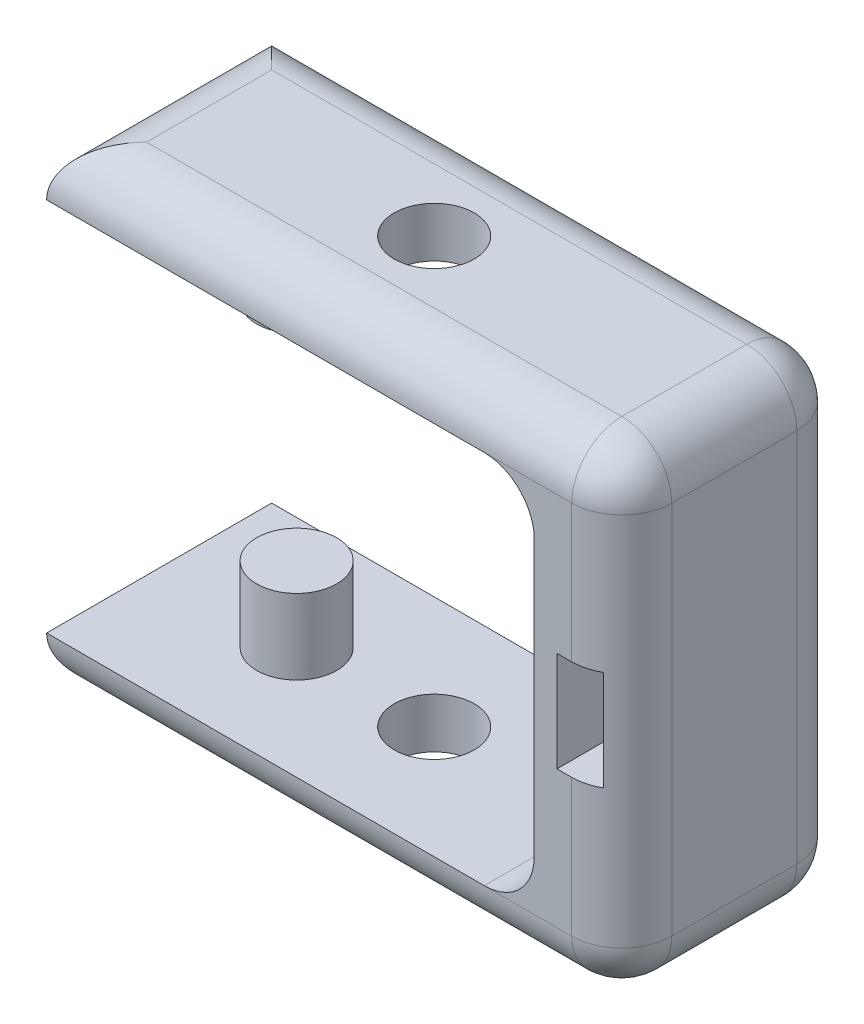
ISO-10303-21;
HEADER;
FILE_DESCRIPTION(('STEP AP214'),'2;1');
FILE_NAME('part.step','',(''),(''),'','','');
FILE_SCHEMA(('AUTOMOTIVE_DESIGN { 1 0 10303 214 1 1 1 1 }'));
ENDSEC;
DATA;
#1=APPLICATION_CONTEXT('core data for automotive mechanical design processes');
#2=APPLICATION_PROTOCOL_DEFINITION('international standard','automotive_design',2000,#1);
#3=PRODUCT_CONTEXT('',#1,'mechanical');
#4=PRODUCT('Part','Part','',(#3));
#5=PRODUCT_RELATED_PRODUCT_CATEGORY('part','',(#4));
#6=PRODUCT_DEFINITION_FORMATION('','',#4);
#7=PRODUCT_DEFINITION_CONTEXT('part definition',#1,'design');
#8=PRODUCT_DEFINITION('design','',#6,#7);
#9=PRODUCT_DEFINITION_SHAPE('','',#8);
#10=(LENGTH_UNIT() NAMED_UNIT(*) SI_UNIT(.MILLI.,.METRE.));
#11=(NAMED_UNIT(*) PLANE_ANGLE_UNIT() SI_UNIT($,.RADIAN.));
#12=(NAMED_UNIT(*) SI_UNIT($,.STERADIAN.) SOLID_ANGLE_UNIT());
#13=UNCERTAINTY_MEASURE_WITH_UNIT(LENGTH_MEASURE(1.E-05),#10,'distance_accuracy_value','');
#14=(GEOMETRIC_REPRESENTATION_CONTEXT(3) GLOBAL_UNCERTAINTY_ASSIGNED_CONTEXT((#13)) GLOBAL_UNIT_ASSIGNED_CONTEXT((#10,
#11,#12)) REPRESENTATION_CONTEXT('',''));
#15=CARTESIAN_POINT('',(0.,0.,0.));
#16=DIRECTION('',(0.,0.,1.));
#17=DIRECTION('',(1.,0.,0.));
#18=AXIS2_PLACEMENT_3D('',#15,#16,#17);
#19=CARTESIAN_POINT('',(0.,0.,-2.25144508670519));
#20=DIRECTION('',(0.,0.,-1.));
#21=DIRECTION('',(-1.,0.,0.));
#22=AXIS2_PLACEMENT_3D('',#19,#20,#21);
#23=PLANE('',#22);
#24=DIRECTION('',(0.,1.,0.));
#25=VECTOR('',#24,1.);
#26=CARTESIAN_POINT('',(10.3670520231214,11.5,-2.25144508670519));
#27=LINE('',#26,#25);
#28=CARTESIAN_POINT('',(10.3670520231214,7.5,-2.25144508670519));
#29=VERTEX_POINT('',#28);
#30=CARTESIAN_POINT('',(10.3670520231214,11.5,-2.25144508670519));
#31=VERTEX_POINT('',#30);
#32=EDGE_CURVE('E234',#29,#31,#27,.T.);
#33=ORIENTED_EDGE('',*,*,#32,.T.);
#34=DIRECTION('',(-1.,0.,0.));
#35=VECTOR('',#34,1.);
#36=CARTESIAN_POINT('',(10.3670520231214,11.5,-2.25144508670519));
#37=LINE('',#36,#35);
#38=CARTESIAN_POINT('',(8.77705202312139,11.5,-2.25144508670519));
#39=VERTEX_POINT('',#38);
#40=EDGE_CURVE('E237',#31,#39,#37,.T.);
#41=ORIENTED_EDGE('',*,*,#40,.T.);
#42=DIRECTION('',(0.,-1.,0.));
#43=VECTOR('',#42,1.);
#44=CARTESIAN_POINT('',(8.77705202312139,11.5,-2.25144508670519));
#45=LINE('',#44,#43);
#46=CARTESIAN_POINT('',(8.77705202312139,7.5,-2.25144508670519));
#47=VERTEX_POINT('',#46);
#48=EDGE_CURVE('E241',#39,#47,#45,.T.);
#49=ORIENTED_EDGE('',*,*,#48,.T.);
#50=DIRECTION('',(1.,0.,0.));
#51=VECTOR('',#50,1.);
#52=CARTESIAN_POINT('',(10.3670520231214,7.5,-2.25144508670519));
#53=LINE('',#52,#51);
#54=EDGE_CURVE('E244',#47,#29,#53,.T.);
#55=ORIENTED_EDGE('',*,*,#54,.T.);
#56=EDGE_LOOP('',(#33,#41,#49,#55));
#57=FACE_BOUND('',#56,.T.);
#58=DIRECTION('',(0.,-1.,0.));
#59=VECTOR('',#58,1.);
#60=CARTESIAN_POINT('',(8.97705202312138,11.3,-2.25144508670519));
#61=LINE('',#60,#59);
#62=CARTESIAN_POINT('',(8.97705202312138,11.3,-2.25144508670519));
#63=VERTEX_POINT('',#62);
#64=CARTESIAN_POINT('',(8.97705202312139,7.7,-2.25144508670519));
#65=VERTEX_POINT('',#64);
#66=EDGE_CURVE('E204',#63,#65,#61,.T.);
#67=ORIENTED_EDGE('',*,*,#66,.F.);
#68=DIRECTION('',(-1.,0.,0.));
#69=VECTOR('',#68,1.);
#70=CARTESIAN_POINT('',(8.97705202312138,11.3,-2.25144508670519));
#71=LINE('',#70,#69);
#72=CARTESIAN_POINT('',(10.1670520231214,11.3,-2.25144508670519));
#73=VERTEX_POINT('',#72);
#74=EDGE_CURVE('E218',#73,#63,#71,.T.);
#75=ORIENTED_EDGE('',*,*,#74,.F.);
#76=DIRECTION('',(0.,1.,0.));
#77=VECTOR('',#76,1.);
#78=CARTESIAN_POINT('',(10.1670520231214,11.3,-2.25144508670519));
#79=LINE('',#78,#77);
#80=CARTESIAN_POINT('',(10.1670520231214,7.7,-2.25144508670519));
#81=VERTEX_POINT('',#80);
#82=EDGE_CURVE('E51',#81,#73,#79,.T.);
#83=ORIENTED_EDGE('',*,*,#82,.F.);
#84=DIRECTION('',(1.,0.,0.));
#85=VECTOR('',#84,1.);
#86=CARTESIAN_POINT('',(8.97705202312139,7.7,-2.25144508670519));
#87=LINE('',#86,#85);
#88=EDGE_CURVE('E225',#65,#81,#87,.T.);
#89=ORIENTED_EDGE('',*,*,#88,.F.);
#90=EDGE_LOOP('',(#67,#75,#83,#89));
#91=FACE_BOUND('',#90,.T.);
#92=ADVANCED_FACE('F36',(#57,#91),#23,.F.);
#93=CARTESIAN_POINT('',(-0.632947976878616,0.,-0.751445086705187));
#94=DIRECTION('',(0.,1.,0.));
#95=DIRECTION('',(0.,0.,1.));
#96=AXIS2_PLACEMENT_3D('',#93,#94,#95);
#97=CYLINDRICAL_SURFACE('',#96,1.6);
#98=CARTESIAN_POINT('',(-0.632947976878616,17.,-0.751445086705187));
#99=DIRECTION('',(0.,1.,0.));
#100=DIRECTION('',(0.,0.,1.));
#101=AXIS2_PLACEMENT_3D('',#98,#99,#100);
#102=CIRCLE('',#101,1.6);
#103=CARTESIAN_POINT('',(-0.632947976878616,17.,0.848554913294813));
#104=VERTEX_POINT('',#103);
#105=EDGE_CURVE('E301',#104,#104,#102,.F.);
#106=ORIENTED_EDGE('',*,*,#105,.T.);
#107=EDGE_LOOP('',(#106));
#108=FACE_BOUND('',#107,.T.);
#109=CARTESIAN_POINT('',(-0.632947976878616,19.,-0.751445086705187));
#110=DIRECTION('',(0.,1.,0.));
#111=DIRECTION('',(0.,0.,1.));
#112=AXIS2_PLACEMENT_3D('',#109,#110,#111);
#113=CIRCLE('',#112,1.6);
#114=CARTESIAN_POINT('',(-0.632947976878616,19.,0.848554913294813));
#115=VERTEX_POINT('',#114);
#116=EDGE_CURVE('E298',#115,#115,#113,.T.);
#117=ORIENTED_EDGE('',*,*,#116,.T.);
#118=EDGE_LOOP('',(#117));
#119=FACE_BOUND('',#118,.T.);
#120=ADVANCED_FACE('F522',(#108,#119),#97,.F.);
#121=CARTESIAN_POINT('',(-11.6329479768786,19.,3.74855491329481));
#122=DIRECTION('',(0.,0.,-1.));
#123=DIRECTION('',(-1.,0.,0.));
#124=AXIS2_PLACEMENT_3D('',#121,#122,#123);
#125=PLANE('',#124);
#126=DIRECTION('',(0.,-1.,0.));
#127=VECTOR('',#126,1.);
#128=CARTESIAN_POINT('',(9.36705202312138,19.,3.74855491329481));
#129=LINE('',#128,#127);
#130=CARTESIAN_POINT('',(9.36705202312138,2.,3.74855491329481));
#131=VERTEX_POINT('',#130);
#132=CARTESIAN_POINT('',(9.36705202312138,7.5,3.74855491329481));
#133=VERTEX_POINT('',#132);
#134=EDGE_CURVE('E332',#131,#133,#129,.F.);
#135=ORIENTED_EDGE('',*,*,#134,.T.);
#136=DIRECTION('',(1.,0.,0.));
#137=VECTOR('',#136,1.);
#138=CARTESIAN_POINT('',(10.3670520231214,7.5,3.74855491329481));
#139=LINE('',#138,#137);
#140=CARTESIAN_POINT('',(8.77705202312139,7.5,3.74855491329481));
#141=VERTEX_POINT('',#140);
#142=EDGE_CURVE('E238',#141,#133,#139,.T.);
#143=ORIENTED_EDGE('',*,*,#142,.F.);
#144=DIRECTION('',(0.,-1.,0.));
#145=VECTOR('',#144,1.);
#146=CARTESIAN_POINT('',(8.77705202312139,11.5,3.74855491329481));
#147=LINE('',#146,#145);
#148=CARTESIAN_POINT('',(8.77705202312139,11.5,3.74855491329481));
#149=VERTEX_POINT('',#148);
#150=EDGE_CURVE('E249',#149,#141,#147,.T.);
#151=ORIENTED_EDGE('',*,*,#150,.F.);
#152=DIRECTION('',(-1.,0.,0.));
#153=VECTOR('',#152,1.);
#154=CARTESIAN_POINT('',(10.3670520231214,11.5,3.74855491329481));
#155=LINE('',#154,#153);
#156=CARTESIAN_POINT('',(9.36705202312138,11.5,3.74855491329481));
#157=VERTEX_POINT('',#156);
#158=EDGE_CURVE('E230',#157,#149,#155,.T.);
#159=ORIENTED_EDGE('',*,*,#158,.F.);
#160=CARTESIAN_POINT('',(9.36705202312138,17.,3.74855491329481));
#161=VERTEX_POINT('',#160);
#162=EDGE_CURVE('E331',#157,#161,#129,.F.);
#163=ORIENTED_EDGE('',*,*,#162,.T.);
#164=DIRECTION('',(1.,0.,0.));
#165=VECTOR('',#164,1.);
#166=CARTESIAN_POINT('',(-11.6329479768786,17.,3.74855491329481));
#167=LINE('',#166,#165);
#168=CARTESIAN_POINT('',(5.86705202312139,17.,3.74855491329481));
#169=VERTEX_POINT('',#168);
#170=EDGE_CURVE('E364',#161,#169,#167,.F.);
#171=ORIENTED_EDGE('',*,*,#170,.T.);
#172=CARTESIAN_POINT('',(5.86705202312139,15.,3.74855491329481));
#173=DIRECTION('',(0.,0.,-1.));
#174=DIRECTION('',(-1.,0.,0.));
#175=AXIS2_PLACEMENT_3D('',#172,#173,#174);
#176=CIRCLE('',#175,2.);
#177=CARTESIAN_POINT('',(7.86705202312139,15.,3.74855491329481));
#178=VERTEX_POINT('',#177);
#179=EDGE_CURVE('E356',#169,#178,#176,.T.);
#180=ORIENTED_EDGE('',*,*,#179,.T.);
#181=DIRECTION('',(0.,1.,0.));
#182=VECTOR('',#181,1.);
#183=CARTESIAN_POINT('',(7.86705202312139,17.,3.74855491329481));
#184=LINE('',#183,#182);
#185=CARTESIAN_POINT('',(7.86705202312139,4.,3.74855491329481));
#186=VERTEX_POINT('',#185);
#187=EDGE_CURVE('E284',#186,#178,#184,.T.);
#188=ORIENTED_EDGE('',*,*,#187,.F.);
#189=CARTESIAN_POINT('',(5.86705202312139,4.,3.74855491329481));
#190=DIRECTION('',(0.,0.,-1.));
#191=DIRECTION('',(-1.,0.,0.));
#192=AXIS2_PLACEMENT_3D('',#189,#190,#191);
#193=CIRCLE('',#192,2.);
#194=CARTESIAN_POINT('',(5.86705202312139,2.,3.74855491329481));
#195=VERTEX_POINT('',#194);
#196=EDGE_CURVE('E360',#186,#195,#193,.T.);
#197=ORIENTED_EDGE('',*,*,#196,.T.);
#198=DIRECTION('',(1.,0.,0.));
#199=VECTOR('',#198,1.);
#200=CARTESIAN_POINT('',(-11.6329479768786,2.,3.74855491329481));
#201=LINE('',#200,#199);
#202=EDGE_CURVE('E367',#195,#131,#201,.T.);
#203=ORIENTED_EDGE('',*,*,#202,.T.);
#204=EDGE_LOOP('',(#135,#143,#151,#159,#163,#171,#180,#188,#197,#203));
#205=FACE_BOUND('',#204,.T.);
#206=ADVANCED_FACE('F457',(#205),#125,.F.);
#207=CARTESIAN_POINT('',(11.3670520231214,19.,-5.25144508670519));
#208=DIRECTION('',(-1.,0.,0.));
#209=DIRECTION('',(0.,0.,1.));
#210=AXIS2_PLACEMENT_3D('',#207,#208,#209);
#211=PLANE('',#210);
#212=DIRECTION('',(0.,-1.,0.));
#213=VECTOR('',#212,1.);
#214=CARTESIAN_POINT('',(11.3670520231214,19.,1.74855491329481));
#215=LINE('',#214,#213);
#216=CARTESIAN_POINT('',(11.3670520231214,17.,1.74855491329481));
#217=VERTEX_POINT('',#216);
#218=CARTESIAN_POINT('',(11.3670520231214,2.,1.74855491329481));
#219=VERTEX_POINT('',#218);
#220=EDGE_CURVE('E342',#217,#219,#215,.T.);
#221=ORIENTED_EDGE('',*,*,#220,.T.);
#222=DIRECTION('',(0.,0.,-1.));
#223=VECTOR('',#222,1.);
#224=CARTESIAN_POINT('',(11.3670520231214,2.,-5.25144508670519));
#225=LINE('',#224,#223);
#226=CARTESIAN_POINT('',(11.3670520231214,2.,-3.25144508670519));
#227=VERTEX_POINT('',#226);
#228=EDGE_CURVE('E344',#219,#227,#225,.T.);
#229=ORIENTED_EDGE('',*,*,#228,.T.);
#230=DIRECTION('',(0.,-1.,0.));
#231=VECTOR('',#230,1.);
#232=CARTESIAN_POINT('',(11.3670520231214,19.,-3.25144508670519));
#233=LINE('',#232,#231);
#234=CARTESIAN_POINT('',(11.3670520231214,17.,-3.25144508670519));
#235=VERTEX_POINT('',#234);
#236=EDGE_CURVE('E340',#227,#235,#233,.F.);
#237=ORIENTED_EDGE('',*,*,#236,.T.);
#238=DIRECTION('',(0.,0.,-1.));
#239=VECTOR('',#238,1.);
#240=CARTESIAN_POINT('',(11.3670520231214,17.,3.74855491329481));
#241=LINE('',#240,#239);
#242=EDGE_CURVE('E338',#235,#217,#241,.F.);
#243=ORIENTED_EDGE('',*,*,#242,.T.);
#244=EDGE_LOOP('',(#221,#229,#237,#243));
#245=FACE_BOUND('',#244,.T.);
#246=ADVANCED_FACE('F475',(#245),#211,.F.);
#247=CARTESIAN_POINT('',(-11.6329479768786,19.,-5.25144508670519));
#248=DIRECTION('',(0.,0.,1.));
#249=DIRECTION('',(1.,0.,0.));
#250=AXIS2_PLACEMENT_3D('',#247,#248,#249);
#251=PLANE('',#250);
#252=DIRECTION('',(0.,-1.,0.));
#253=VECTOR('',#252,1.);
#254=CARTESIAN_POINT('',(9.36705202312138,19.,-5.25144508670519));
#255=LINE('',#254,#253);
#256=CARTESIAN_POINT('',(9.36705202312138,17.,-5.25144508670519));
#257=VERTEX_POINT('',#256);
#258=CARTESIAN_POINT('',(9.36705202312138,11.3,-5.25144508670519));
#259=VERTEX_POINT('',#258);
#260=EDGE_CURVE('E336',#257,#259,#255,.T.);
#261=ORIENTED_EDGE('',*,*,#260,.T.);
#262=DIRECTION('',(-1.,0.,0.));
#263=VECTOR('',#262,1.);
#264=CARTESIAN_POINT('',(8.97705202312138,11.3,-5.25144508670519));
#265=LINE('',#264,#263);
#266=CARTESIAN_POINT('',(8.97705202312138,11.3,-5.25144508670519));
#267=VERTEX_POINT('',#266);
#268=EDGE_CURVE('E206',#259,#267,#265,.T.);
#269=ORIENTED_EDGE('',*,*,#268,.T.);
#270=DIRECTION('',(0.,-1.,0.));
#271=VECTOR('',#270,1.);
#272=CARTESIAN_POINT('',(8.97705202312138,11.3,-5.25144508670519));
#273=LINE('',#272,#271);
#274=CARTESIAN_POINT('',(8.97705202312139,7.7,-5.25144508670519));
#275=VERTEX_POINT('',#274);
#276=EDGE_CURVE('E201',#267,#275,#273,.T.);
#277=ORIENTED_EDGE('',*,*,#276,.T.);
#278=DIRECTION('',(1.,0.,0.));
#279=VECTOR('',#278,1.);
#280=CARTESIAN_POINT('',(8.97705202312139,7.7,-5.25144508670519));
#281=LINE('',#280,#279);
#282=CARTESIAN_POINT('',(9.36705202312138,7.7,-5.25144508670519));
#283=VERTEX_POINT('',#282);
#284=EDGE_CURVE('E209',#275,#283,#281,.T.);
#285=ORIENTED_EDGE('',*,*,#284,.T.);
#286=CARTESIAN_POINT('',(9.36705202312138,2.,-5.25144508670519));
#287=VERTEX_POINT('',#286);
#288=EDGE_CURVE('E335',#283,#287,#255,.T.);
#289=ORIENTED_EDGE('',*,*,#288,.T.);
#290=DIRECTION('',(-1.,0.,0.));
#291=VECTOR('',#290,1.);
#292=CARTESIAN_POINT('',(-11.6329479768786,2.,-5.25144508670519));
#293=LINE('',#292,#291);
#294=CARTESIAN_POINT('',(5.86705202312139,2.,-5.25144508670519));
#295=VERTEX_POINT('',#294);
#296=EDGE_CURVE('E371',#287,#295,#293,.T.);
#297=ORIENTED_EDGE('',*,*,#296,.T.);
#298=CARTESIAN_POINT('',(5.86705202312139,4.,-5.25144508670519));
#299=DIRECTION('',(0.,0.,1.));
#300=DIRECTION('',(1.,0.,0.));
#301=AXIS2_PLACEMENT_3D('',#298,#299,#300);
#302=CIRCLE('',#301,2.);
#303=CARTESIAN_POINT('',(7.86705202312139,4.,-5.25144508670519));
#304=VERTEX_POINT('',#303);
#305=EDGE_CURVE('E362',#295,#304,#302,.T.);
#306=ORIENTED_EDGE('',*,*,#305,.T.);
#307=DIRECTION('',(0.,1.,0.));
#308=VECTOR('',#307,1.);
#309=CARTESIAN_POINT('',(7.86705202312139,17.,-5.25144508670519));
#310=LINE('',#309,#308);
#311=CARTESIAN_POINT('',(7.86705202312139,15.,-5.25144508670519));
#312=VERTEX_POINT('',#311);
#313=EDGE_CURVE('E274',#304,#312,#310,.T.);
#314=ORIENTED_EDGE('',*,*,#313,.T.);
#315=CARTESIAN_POINT('',(5.86705202312139,15.,-5.25144508670519));
#316=DIRECTION('',(0.,0.,1.));
#317=DIRECTION('',(1.,0.,0.));
#318=AXIS2_PLACEMENT_3D('',#315,#316,#317);
#319=CIRCLE('',#318,2.);
#320=CARTESIAN_POINT('',(5.86705202312139,17.,-5.25144508670519));
#321=VERTEX_POINT('',#320);
#322=EDGE_CURVE('E358',#312,#321,#319,.T.);
#323=ORIENTED_EDGE('',*,*,#322,.T.);
#324=DIRECTION('',(-1.,0.,0.));
#325=VECTOR('',#324,1.);
#326=CARTESIAN_POINT('',(11.3670520231214,17.,-5.25144508670519));
#327=LINE('',#326,#325);
#328=EDGE_CURVE('E369',#321,#257,#327,.F.);
#329=ORIENTED_EDGE('',*,*,#328,.T.);
#330=EDGE_LOOP('',(#261,#269,#277,#285,#289,#297,#306,#314,#323,#329));
#331=FACE_BOUND('',#330,.T.);
#332=ADVANCED_FACE('F217',(#331),#251,.F.);
#333=CARTESIAN_POINT('',(0.,19.,0.));
#334=DIRECTION('',(0.,1.,0.));
#335=DIRECTION('',(0.,0.,1.));
#336=AXIS2_PLACEMENT_3D('',#333,#334,#335);
#337=PLANE('',#336);
#338=DIRECTION('',(0.,0.,-1.));
#339=VECTOR('',#338,1.);
#340=CARTESIAN_POINT('',(9.36705202312138,19.,-5.25144508670519));
#341=LINE('',#340,#339);
#342=CARTESIAN_POINT('',(9.36705202312138,19.,1.74855491329481));
#343=VERTEX_POINT('',#342);
#344=CARTESIAN_POINT('',(9.36705202312138,19.,-3.25144508670519));
#345=VERTEX_POINT('',#344);
#346=EDGE_CURVE('E351',#343,#345,#341,.T.);
#347=ORIENTED_EDGE('',*,*,#346,.T.);
#348=DIRECTION('',(-1.,0.,0.));
#349=VECTOR('',#348,1.);
#350=CARTESIAN_POINT('',(-11.6329479768786,19.,-3.25144508670519));
#351=LINE('',#350,#349);
#352=CARTESIAN_POINT('',(-9.63294797687862,19.,-3.25144508670519));
#353=VERTEX_POINT('',#352);
#354=EDGE_CURVE('E353',#345,#353,#351,.T.);
#355=ORIENTED_EDGE('',*,*,#354,.T.);
#356=DIRECTION('',(0.,0.,1.));
#357=VECTOR('',#356,1.);
#358=CARTESIAN_POINT('',(-9.63294797687861,19.,3.74855491329481));
#359=LINE('',#358,#357);
#360=CARTESIAN_POINT('',(-9.63294797687861,19.,1.74855491329481));
#361=VERTEX_POINT('',#360);
#362=EDGE_CURVE('E347',#353,#361,#359,.T.);
#363=ORIENTED_EDGE('',*,*,#362,.T.);
#364=DIRECTION('',(1.,0.,0.));
#365=VECTOR('',#364,1.);
#366=CARTESIAN_POINT('',(11.3670520231214,19.,1.74855491329481));
#367=LINE('',#366,#365);
#368=EDGE_CURVE('E349',#361,#343,#367,.T.);
#369=ORIENTED_EDGE('',*,*,#368,.T.);
#370=EDGE_LOOP('',(#347,#355,#363,#369));
#371=FACE_BOUND('',#370,.T.);
#372=ORIENTED_EDGE('',*,*,#116,.F.);
#373=EDGE_LOOP('',(#372));
#374=FACE_BOUND('',#373,.T.);
#375=ADVANCED_FACE('F573',(#371,#374),#337,.T.);
#376=CARTESIAN_POINT('',(0.,0.,0.));
#377=DIRECTION('',(0.,1.,0.));
#378=DIRECTION('',(0.,0.,1.));
#379=AXIS2_PLACEMENT_3D('',#376,#377,#378);
#380=PLANE('',#379);
#381=DIRECTION('',(1.,0.,0.));
#382=VECTOR('',#381,1.);
#383=CARTESIAN_POINT('',(0.,0.,1.74855491329481));
#384=LINE('',#383,#382);
#385=CARTESIAN_POINT('',(9.36705202312138,0.,1.74855491329481));
#386=VERTEX_POINT('',#385);
#387=CARTESIAN_POINT('',(-9.63294797687861,0.,1.74855491329481));
#388=VERTEX_POINT('',#387);
#389=EDGE_CURVE('E326',#386,#388,#384,.F.);
#390=ORIENTED_EDGE('',*,*,#389,.T.);
#391=DIRECTION('',(0.,0.,1.));
#392=VECTOR('',#391,1.);
#393=CARTESIAN_POINT('',(-9.63294797687861,0.,0.));
#394=LINE('',#393,#392);
#395=CARTESIAN_POINT('',(-9.63294797687862,0.,-3.25144508670519));
#396=VERTEX_POINT('',#395);
#397=EDGE_CURVE('E328',#388,#396,#394,.F.);
#398=ORIENTED_EDGE('',*,*,#397,.T.);
#399=DIRECTION('',(-1.,0.,0.));
#400=VECTOR('',#399,1.);
#401=CARTESIAN_POINT('',(0.,0.,-3.25144508670519));
#402=LINE('',#401,#400);
#403=CARTESIAN_POINT('',(9.36705202312138,0.,-3.25144508670519));
#404=VERTEX_POINT('',#403);
#405=EDGE_CURVE('E324',#396,#404,#402,.F.);
#406=ORIENTED_EDGE('',*,*,#405,.T.);
#407=DIRECTION('',(0.,0.,-1.));
#408=VECTOR('',#407,1.);
#409=CARTESIAN_POINT('',(9.36705202312138,0.,0.));
#410=LINE('',#409,#408);
#411=EDGE_CURVE('E322',#404,#386,#410,.F.);
#412=ORIENTED_EDGE('',*,*,#411,.T.);
#413=EDGE_LOOP('',(#390,#398,#406,#412));
#414=FACE_BOUND('',#413,.T.);
#415=CARTESIAN_POINT('',(-0.632947976878616,0.,-0.751445086705187));
#416=DIRECTION('',(0.,1.,0.));
#417=DIRECTION('',(0.,0.,1.));
#418=AXIS2_PLACEMENT_3D('',#415,#416,#417);
#419=CIRCLE('',#418,1.6);
#420=CARTESIAN_POINT('',(-0.632947976878616,0.,0.848554913294813));
#421=VERTEX_POINT('',#420);
#422=EDGE_CURVE('E294',#421,#421,#419,.T.);
#423=ORIENTED_EDGE('',*,*,#422,.T.);
#424=EDGE_LOOP('',(#423));
#425=FACE_BOUND('',#424,.T.);
#426=ADVANCED_FACE('F566',(#414,#425),#380,.F.);
#427=CARTESIAN_POINT('',(-0.632947976878616,2.,-0.751445086705187));
#428=DIRECTION('',(0.,-1.,0.));
#429=DIRECTION('',(0.,0.,-1.));
#430=AXIS2_PLACEMENT_3D('',#427,#428,#429);
#431=CIRCLE('',#430,1.6);
#432=CARTESIAN_POINT('',(-0.632947976878616,2.,-2.35144508670519));
#433=VERTEX_POINT('',#432);
#434=EDGE_CURVE('E291',#433,#433,#431,.F.);
#435=ORIENTED_EDGE('',*,*,#434,.T.);
#436=EDGE_LOOP('',(#435));
#437=FACE_BOUND('',#436,.T.);
#438=ORIENTED_EDGE('',*,*,#422,.F.);
#439=EDGE_LOOP('',(#438));
#440=FACE_BOUND('',#439,.T.);
#441=ADVANCED_FACE('F530',(#437,#440),#97,.F.);
#442=CARTESIAN_POINT('',(-11.6329479768786,17.,-5.25144508670519));
#443=DIRECTION('',(0.,1.,0.));
#444=DIRECTION('',(0.,0.,1.));
#445=AXIS2_PLACEMENT_3D('',#442,#443,#444);
#446=PLANE('',#445);
#447=CARTESIAN_POINT('',(-6.13294797687861,17.,-0.751445086705187));
#448=DIRECTION('',(0.,1.,0.));
#449=DIRECTION('',(0.,0.,1.));
#450=AXIS2_PLACEMENT_3D('',#447,#448,#449);
#451=CIRCLE('',#450,1.6);
#452=CARTESIAN_POINT('',(-6.13294797687861,17.,0.848554913294813));
#453=VERTEX_POINT('',#452);
#454=EDGE_CURVE('E308',#453,#453,#451,.F.);
#455=ORIENTED_EDGE('',*,*,#454,.F.);
#456=EDGE_LOOP('',(#455));
#457=FACE_BOUND('',#456,.T.);
#458=DIRECTION('',(-1.,0.,0.));
#459=VECTOR('',#458,1.);
#460=CARTESIAN_POINT('',(-11.6329479768786,17.,-5.25144508670519));
#461=LINE('',#460,#459);
#462=CARTESIAN_POINT('',(-11.6329479768786,17.,-5.25144508670519));
#463=VERTEX_POINT('',#462);
#464=EDGE_CURVE('E278',#321,#463,#461,.T.);
#465=ORIENTED_EDGE('',*,*,#464,.F.);
#466=DIRECTION('',(0.,0.,1.));
#467=VECTOR('',#466,1.);
#468=CARTESIAN_POINT('',(5.86705202312139,17.,3.74855491329481));
#469=LINE('',#468,#467);
#470=EDGE_CURVE('E311',#321,#169,#469,.T.);
#471=ORIENTED_EDGE('',*,*,#470,.T.);
#472=DIRECTION('',(-1.,0.,0.));
#473=VECTOR('',#472,1.);
#474=CARTESIAN_POINT('',(-11.6329479768786,17.,3.74855491329481));
#475=LINE('',#474,#473);
#476=CARTESIAN_POINT('',(-11.6329479768786,17.,3.74855491329481));
#477=VERTEX_POINT('',#476);
#478=EDGE_CURVE('E275',#169,#477,#475,.T.);
#479=ORIENTED_EDGE('',*,*,#478,.T.);
#480=DIRECTION('',(0.,0.,1.));
#481=VECTOR('',#480,1.);
#482=CARTESIAN_POINT('',(-11.6329479768786,17.,-5.25144508670519));
#483=LINE('',#482,#481);
#484=EDGE_CURVE('E288',#463,#477,#483,.T.);
#485=ORIENTED_EDGE('',*,*,#484,.F.);
#486=EDGE_LOOP('',(#465,#471,#479,#485));
#487=FACE_BOUND('',#486,.T.);
#488=ORIENTED_EDGE('',*,*,#105,.F.);
#489=EDGE_LOOP('',(#488));
#490=FACE_BOUND('',#489,.T.);
#491=ADVANCED_FACE('F493',(#457,#487,#490),#446,.F.);
#492=CARTESIAN_POINT('',(-11.6329479768786,2.,-5.25144508670519));
#493=DIRECTION('',(0.,-1.,0.));
#494=DIRECTION('',(0.,0.,-1.));
#495=AXIS2_PLACEMENT_3D('',#492,#493,#494);
#496=PLANE('',#495);
#497=CARTESIAN_POINT('',(-6.13294797687861,2.,-0.751445086705187));
#498=DIRECTION('',(0.,-1.,0.));
#499=DIRECTION('',(0.,0.,-1.));
#500=AXIS2_PLACEMENT_3D('',#497,#498,#499);
#501=CIRCLE('',#500,1.6);
#502=CARTESIAN_POINT('',(-6.13294797687861,2.,-2.35144508670519));
#503=VERTEX_POINT('',#502);
#504=EDGE_CURVE('E297',#503,#503,#501,.F.);
#505=ORIENTED_EDGE('',*,*,#504,.F.);
#506=EDGE_LOOP('',(#505));
#507=FACE_BOUND('',#506,.T.);
#508=DIRECTION('',(1.,0.,0.));
#509=VECTOR('',#508,1.);
#510=CARTESIAN_POINT('',(-11.6329479768786,2.,3.74855491329481));
#511=LINE('',#510,#509);
#512=CARTESIAN_POINT('',(-11.6329479768786,2.,3.74855491329481));
#513=VERTEX_POINT('',#512);
#514=EDGE_CURVE('E270',#513,#195,#511,.T.);
#515=ORIENTED_EDGE('',*,*,#514,.T.);
#516=DIRECTION('',(0.,0.,1.));
#517=VECTOR('',#516,1.);
#518=CARTESIAN_POINT('',(5.86705202312139,2.,-5.25144508670519));
#519=LINE('',#518,#517);
#520=EDGE_CURVE('E319',#195,#295,#519,.F.);
#521=ORIENTED_EDGE('',*,*,#520,.T.);
#522=DIRECTION('',(1.,0.,0.));
#523=VECTOR('',#522,1.);
#524=CARTESIAN_POINT('',(-11.6329479768786,2.,-5.25144508670519));
#525=LINE('',#524,#523);
#526=CARTESIAN_POINT('',(-11.6329479768786,2.,-5.25144508670519));
#527=VERTEX_POINT('',#526);
#528=EDGE_CURVE('E271',#527,#295,#525,.T.);
#529=ORIENTED_EDGE('',*,*,#528,.F.);
#530=DIRECTION('',(0.,0.,1.));
#531=VECTOR('',#530,1.);
#532=CARTESIAN_POINT('',(-11.6329479768786,2.,-5.25144508670519));
#533=LINE('',#532,#531);
#534=EDGE_CURVE('E281',#527,#513,#533,.T.);
#535=ORIENTED_EDGE('',*,*,#534,.T.);
#536=EDGE_LOOP('',(#515,#521,#529,#535));
#537=FACE_BOUND('',#536,.T.);
#538=ORIENTED_EDGE('',*,*,#434,.F.);
#539=EDGE_LOOP('',(#538));
#540=FACE_BOUND('',#539,.T.);
#541=ADVANCED_FACE('F436',(#507,#537,#540),#496,.F.);
#542=CARTESIAN_POINT('',(7.86705202312139,17.,-5.25144508670519));
#543=DIRECTION('',(1.,0.,0.));
#544=DIRECTION('',(0.,1.,0.));
#545=AXIS2_PLACEMENT_3D('',#542,#543,#544);
#546=PLANE('',#545);
#547=ORIENTED_EDGE('',*,*,#187,.T.);
#548=DIRECTION('',(0.,0.,1.));
#549=VECTOR('',#548,1.);
#550=CARTESIAN_POINT('',(7.86705202312139,15.,-5.25144508670519));
#551=LINE('',#550,#549);
#552=EDGE_CURVE('E317',#178,#312,#551,.F.);
#553=ORIENTED_EDGE('',*,*,#552,.T.);
#554=ORIENTED_EDGE('',*,*,#313,.F.);
#555=DIRECTION('',(0.,0.,1.));
#556=VECTOR('',#555,1.);
#557=CARTESIAN_POINT('',(7.86705202312139,4.,3.74855491329481));
#558=LINE('',#557,#556);
#559=EDGE_CURVE('E314',#304,#186,#558,.T.);
#560=ORIENTED_EDGE('',*,*,#559,.T.);
#561=EDGE_LOOP('',(#547,#553,#554,#560));
#562=FACE_BOUND('',#561,.T.);
#563=ADVANCED_FACE('F507',(#562),#546,.F.);
#564=CARTESIAN_POINT('',(-6.13294797687861,5.,-0.751445086705187));
#565=DIRECTION('',(0.,-1.,0.));
#566=DIRECTION('',(0.,0.,-1.));
#567=AXIS2_PLACEMENT_3D('',#564,#565,#566);
#568=CYLINDRICAL_SURFACE('',#567,1.6);
#569=CARTESIAN_POINT('',(-6.13294797687861,5.,-0.751445086705187));
#570=DIRECTION('',(0.,1.,0.));
#571=DIRECTION('',(0.,0.,1.));
#572=AXIS2_PLACEMENT_3D('',#569,#570,#571);
#573=CIRCLE('',#572,1.6);
#574=CARTESIAN_POINT('',(-6.13294797687861,5.,0.848554913294813));
#575=VERTEX_POINT('',#574);
#576=EDGE_CURVE('E266',#575,#575,#573,.T.);
#577=ORIENTED_EDGE('',*,*,#576,.F.);
#578=EDGE_LOOP('',(#577));
#579=FACE_BOUND('',#578,.T.);
#580=ORIENTED_EDGE('',*,*,#504,.T.);
#581=EDGE_LOOP('',(#580));
#582=FACE_BOUND('',#581,.T.);
#583=ADVANCED_FACE('F509',(#579,#582),#568,.T.);
#584=CARTESIAN_POINT('',(-6.13294797687861,5.,-0.751445086705187));
#585=DIRECTION('',(0.,1.,0.));
#586=DIRECTION('',(0.,0.,1.));
#587=AXIS2_PLACEMENT_3D('',#584,#585,#586);
#588=PLANE('',#587);
#589=ORIENTED_EDGE('',*,*,#576,.T.);
#590=EDGE_LOOP('',(#589));
#591=FACE_BOUND('',#590,.T.);
#592=ADVANCED_FACE('F515',(#591),#588,.T.);
#593=CARTESIAN_POINT('',(-6.13294797687861,14.,-0.751445086705187));
#594=DIRECTION('',(0.,1.,0.));
#595=DIRECTION('',(0.,0.,1.));
#596=AXIS2_PLACEMENT_3D('',#593,#594,#595);
#597=CYLINDRICAL_SURFACE('',#596,1.6);
#598=CARTESIAN_POINT('',(-6.13294797687861,14.,-0.751445086705187));
#599=DIRECTION('',(0.,-1.,0.));
#600=DIRECTION('',(0.,0.,-1.));
#601=AXIS2_PLACEMENT_3D('',#598,#599,#600);
#602=CIRCLE('',#601,1.6);
#603=CARTESIAN_POINT('',(-6.13294797687861,14.,-2.35144508670519));
#604=VERTEX_POINT('',#603);
#605=EDGE_CURVE('E263',#604,#604,#602,.T.);
#606=ORIENTED_EDGE('',*,*,#605,.F.);
#607=EDGE_LOOP('',(#606));
#608=FACE_BOUND('',#607,.T.);
#609=ORIENTED_EDGE('',*,*,#454,.T.);
#610=EDGE_LOOP('',(#609));
#611=FACE_BOUND('',#610,.T.);
#612=ADVANCED_FACE('F554',(#608,#611),#597,.T.);
#613=CARTESIAN_POINT('',(-6.13294797687861,14.,-0.751445086705187));
#614=DIRECTION('',(0.,-1.,0.));
#615=DIRECTION('',(0.,0.,-1.));
#616=AXIS2_PLACEMENT_3D('',#613,#614,#615);
#617=PLANE('',#616);
#618=ORIENTED_EDGE('',*,*,#605,.T.);
#619=EDGE_LOOP('',(#618));
#620=FACE_BOUND('',#619,.T.);
#621=ADVANCED_FACE('F551',(#620),#617,.T.);
#622=CARTESIAN_POINT('',(5.86705202312139,15.,-5.25144508670519));
#623=DIRECTION('',(0.,0.,-1.));
#624=DIRECTION('',(-1.,0.,0.));
#625=AXIS2_PLACEMENT_3D('',#622,#623,#624);
#626=CYLINDRICAL_SURFACE('',#625,2.);
#627=ORIENTED_EDGE('',*,*,#322,.F.);
#628=ORIENTED_EDGE('',*,*,#552,.F.);
#629=ORIENTED_EDGE('',*,*,#179,.F.);
#630=ORIENTED_EDGE('',*,*,#470,.F.);
#631=EDGE_LOOP('',(#627,#628,#629,#630));
#632=FACE_BOUND('',#631,.T.);
#633=ADVANCED_FACE('F498',(#632),#626,.F.);
#634=CARTESIAN_POINT('',(5.86705202312139,4.,-5.25144508670519));
#635=DIRECTION('',(0.,0.,-1.));
#636=DIRECTION('',(-1.,0.,0.));
#637=AXIS2_PLACEMENT_3D('',#634,#635,#636);
#638=CYLINDRICAL_SURFACE('',#637,2.);
#639=ORIENTED_EDGE('',*,*,#305,.F.);
#640=ORIENTED_EDGE('',*,*,#520,.F.);
#641=ORIENTED_EDGE('',*,*,#196,.F.);
#642=ORIENTED_EDGE('',*,*,#559,.F.);
#643=EDGE_LOOP('',(#639,#640,#641,#642));
#644=FACE_BOUND('',#643,.T.);
#645=ADVANCED_FACE('F443',(#644),#638,.F.);
#646=CARTESIAN_POINT('',(-9.63294797687861,17.,0.));
#647=DIRECTION('',(0.,0.,-1.));
#648=DIRECTION('',(-1.,0.,0.));
#649=AXIS2_PLACEMENT_3D('',#646,#647,#648);
#650=CYLINDRICAL_SURFACE('',#649,2.);
#651=CARTESIAN_POINT('',(-9.63294797687861,17.,1.74855491329481));
#652=DIRECTION('',(-0.707106781186548,0.,-0.707106781186547));
#653=DIRECTION('',(0.707106781186547,0.,-0.707106781186548));
#654=AXIS2_PLACEMENT_3D('',#651,#652,#653);
#655=ELLIPSE('',#654,2.82842712474619,2.);
#656=EDGE_CURVE('E412',#361,#477,#655,.F.);
#657=ORIENTED_EDGE('',*,*,#656,.F.);
#658=ORIENTED_EDGE('',*,*,#362,.F.);
#659=CARTESIAN_POINT('',(-9.63294797687861,17.,-3.25144508670519));
#660=DIRECTION('',(0.707106781186547,0.,-0.707106781186548));
#661=DIRECTION('',(-0.707106781186548,0.,-0.707106781186547));
#662=AXIS2_PLACEMENT_3D('',#659,#660,#661);
#663=ELLIPSE('',#662,2.82842712474619,2.);
#664=EDGE_CURVE('E267',#463,#353,#663,.T.);
#665=ORIENTED_EDGE('',*,*,#664,.F.);
#666=ORIENTED_EDGE('',*,*,#484,.T.);
#667=EDGE_LOOP('',(#657,#658,#665,#666));
#668=FACE_BOUND('',#667,.T.);
#669=ADVANCED_FACE('F38',(#668),#650,.T.);
#670=CARTESIAN_POINT('',(0.,17.,-3.25144508670519));
#671=DIRECTION('',(1.,0.,0.));
#672=DIRECTION('',(0.,0.,-1.));
#673=AXIS2_PLACEMENT_3D('',#670,#671,#672);
#674=CYLINDRICAL_SURFACE('',#673,2.);
#675=ORIENTED_EDGE('',*,*,#664,.T.);
#676=ORIENTED_EDGE('',*,*,#354,.F.);
#677=CARTESIAN_POINT('',(9.36705202312138,17.,-3.25144508670519));
#678=DIRECTION('',(1.,0.,0.));
#679=DIRECTION('',(0.,1.,0.));
#680=AXIS2_PLACEMENT_3D('',#677,#678,#679);
#681=CIRCLE('',#680,2.);
#682=EDGE_CURVE('E406',#257,#345,#681,.T.);
#683=ORIENTED_EDGE('',*,*,#682,.F.);
#684=ORIENTED_EDGE('',*,*,#328,.F.);
#685=ORIENTED_EDGE('',*,*,#464,.T.);
#686=EDGE_LOOP('',(#675,#676,#683,#684,#685));
#687=FACE_BOUND('',#686,.T.);
#688=ADVANCED_FACE('F502',(#687),#674,.T.);
#689=CARTESIAN_POINT('',(0.,17.,1.74855491329481));
#690=DIRECTION('',(-1.,0.,0.));
#691=DIRECTION('',(0.,0.,1.));
#692=AXIS2_PLACEMENT_3D('',#689,#690,#691);
#693=CYLINDRICAL_SURFACE('',#692,2.);
#694=ORIENTED_EDGE('',*,*,#478,.F.);
#695=ORIENTED_EDGE('',*,*,#170,.F.);
#696=CARTESIAN_POINT('',(9.36705202312138,17.,1.74855491329481));
#697=DIRECTION('',(1.,0.,0.));
#698=DIRECTION('',(0.,0.,-1.));
#699=AXIS2_PLACEMENT_3D('',#696,#697,#698);
#700=CIRCLE('',#699,2.);
#701=EDGE_CURVE('E403',#343,#161,#700,.T.);
#702=ORIENTED_EDGE('',*,*,#701,.F.);
#703=ORIENTED_EDGE('',*,*,#368,.F.);
#704=ORIENTED_EDGE('',*,*,#656,.T.);
#705=EDGE_LOOP('',(#694,#695,#702,#703,#704));
#706=FACE_BOUND('',#705,.T.);
#707=ADVANCED_FACE('F488',(#706),#693,.T.);
#708=CARTESIAN_POINT('',(9.36705202312138,17.,0.));
#709=DIRECTION('',(0.,0.,1.));
#710=DIRECTION('',(1.,0.,0.));
#711=AXIS2_PLACEMENT_3D('',#708,#709,#710);
#712=CYLINDRICAL_SURFACE('',#711,2.);
#713=CARTESIAN_POINT('',(9.36705202312138,17.,-3.25144508670519));
#714=DIRECTION('',(0.,0.,-1.));
#715=DIRECTION('',(-1.,0.,0.));
#716=AXIS2_PLACEMENT_3D('',#713,#714,#715);
#717=CIRCLE('',#716,2.);
#718=EDGE_CURVE('E409',#345,#235,#717,.T.);
#719=ORIENTED_EDGE('',*,*,#718,.F.);
#720=ORIENTED_EDGE('',*,*,#346,.F.);
#721=CARTESIAN_POINT('',(9.36705202312138,17.,1.74855491329481));
#722=DIRECTION('',(0.,0.,1.));
#723=DIRECTION('',(1.,0.,0.));
#724=AXIS2_PLACEMENT_3D('',#721,#722,#723);
#725=CIRCLE('',#724,2.);
#726=EDGE_CURVE('E400',#217,#343,#725,.T.);
#727=ORIENTED_EDGE('',*,*,#726,.F.);
#728=ORIENTED_EDGE('',*,*,#242,.F.);
#729=EDGE_LOOP('',(#719,#720,#727,#728));
#730=FACE_BOUND('',#729,.T.);
#731=ADVANCED_FACE('F614',(#730),#712,.T.);
#732=CARTESIAN_POINT('',(9.36705202312138,17.,-3.25144508670519));
#733=DIRECTION('',(0.,0.,1.));
#734=DIRECTION('',(1.,0.,0.));
#735=AXIS2_PLACEMENT_3D('',#732,#733,#734);
#736=SPHERICAL_SURFACE('',#735,2.);
#737=ORIENTED_EDGE('',*,*,#682,.T.);
#738=ORIENTED_EDGE('',*,*,#718,.T.);
#739=CARTESIAN_POINT('',(9.36705202312138,17.,-3.25144508670519));
#740=DIRECTION('',(0.,1.,0.));
#741=DIRECTION('',(0.,0.,1.));
#742=AXIS2_PLACEMENT_3D('',#739,#740,#741);
#743=CIRCLE('',#742,2.);
#744=EDGE_CURVE('E397',#257,#235,#743,.F.);
#745=ORIENTED_EDGE('',*,*,#744,.F.);
#746=EDGE_LOOP('',(#737,#738,#745));
#747=FACE_BOUND('',#746,.T.);
#748=ADVANCED_FACE('F611',(#747),#736,.T.);
#749=CARTESIAN_POINT('',(9.36705202312138,17.,1.74855491329481));
#750=DIRECTION('',(0.,0.,1.));
#751=DIRECTION('',(1.,0.,0.));
#752=AXIS2_PLACEMENT_3D('',#749,#750,#751);
#753=SPHERICAL_SURFACE('',#752,2.);
#754=ORIENTED_EDGE('',*,*,#726,.T.);
#755=ORIENTED_EDGE('',*,*,#701,.T.);
#756=CARTESIAN_POINT('',(9.36705202312138,17.,1.74855491329481));
#757=DIRECTION('',(0.,1.,0.));
#758=DIRECTION('',(0.,0.,1.));
#759=AXIS2_PLACEMENT_3D('',#756,#757,#758);
#760=CIRCLE('',#759,2.);
#761=EDGE_CURVE('E394',#217,#161,#760,.F.);
#762=ORIENTED_EDGE('',*,*,#761,.F.);
#763=EDGE_LOOP('',(#754,#755,#762));
#764=FACE_BOUND('',#763,.T.);
#765=ADVANCED_FACE('F482',(#764),#753,.T.);
#766=CARTESIAN_POINT('',(9.36705202312138,19.,-3.25144508670519));
#767=DIRECTION('',(0.,-1.,0.));
#768=DIRECTION('',(0.,0.,-1.));
#769=AXIS2_PLACEMENT_3D('',#766,#767,#768);
#770=CYLINDRICAL_SURFACE('',#769,2.);
#771=CARTESIAN_POINT('',(9.36705202312138,11.3,-3.25144508670519));
#772=DIRECTION('',(0.,1.,0.));
#773=DIRECTION('',(0.,0.,1.));
#774=AXIS2_PLACEMENT_3D('',#771,#772,#773);
#775=CIRCLE('',#774,2.);
#776=CARTESIAN_POINT('',(10.1670520231214,11.3,-5.08447536468752));
#777=VERTEX_POINT('',#776);
#778=EDGE_CURVE('E12',#259,#777,#775,.F.);
#779=ORIENTED_EDGE('',*,*,#778,.F.);
#780=ORIENTED_EDGE('',*,*,#260,.F.);
#781=ORIENTED_EDGE('',*,*,#744,.T.);
#782=ORIENTED_EDGE('',*,*,#236,.F.);
#783=CARTESIAN_POINT('',(9.36705202312138,2.,-3.25144508670519));
#784=DIRECTION('',(0.,-1.,0.));
#785=DIRECTION('',(0.,0.,-1.));
#786=AXIS2_PLACEMENT_3D('',#783,#784,#785);
#787=CIRCLE('',#786,2.);
#788=EDGE_CURVE('E389',#287,#227,#787,.T.);
#789=ORIENTED_EDGE('',*,*,#788,.F.);
#790=ORIENTED_EDGE('',*,*,#288,.F.);
#791=CARTESIAN_POINT('',(9.36705202312138,7.7,-3.25144508670519));
#792=DIRECTION('',(0.,-1.,0.));
#793=DIRECTION('',(0.,0.,-1.));
#794=AXIS2_PLACEMENT_3D('',#791,#792,#793);
#795=CIRCLE('',#794,2.);
#796=CARTESIAN_POINT('',(10.1670520231214,7.7,-5.08447536468752));
#797=VERTEX_POINT('',#796);
#798=EDGE_CURVE('E212',#797,#283,#795,.F.);
#799=ORIENTED_EDGE('',*,*,#798,.F.);
#800=DIRECTION('',(0.,-1.,0.));
#801=VECTOR('',#800,1.);
#802=CARTESIAN_POINT('',(10.1670520231214,19.,-5.08447536468752));
#803=LINE('',#802,#801);
#804=EDGE_CURVE('E44',#777,#797,#803,.T.);
#805=ORIENTED_EDGE('',*,*,#804,.F.);
#806=EDGE_LOOP('',(#779,#780,#781,#782,#789,#790,#799,#805));
#807=FACE_BOUND('',#806,.T.);
#808=ADVANCED_FACE('F426',(#807),#770,.T.);
#809=CARTESIAN_POINT('',(9.36705202312138,19.,1.74855491329481));
#810=DIRECTION('',(0.,-1.,0.));
#811=DIRECTION('',(0.,0.,-1.));
#812=AXIS2_PLACEMENT_3D('',#809,#810,#811);
#813=CYLINDRICAL_SURFACE('',#812,2.);
#814=CARTESIAN_POINT('',(9.36705202312138,7.5,1.74855491329481));
#815=DIRECTION('',(0.,-1.,0.));
#816=DIRECTION('',(0.,0.,-1.));
#817=AXIS2_PLACEMENT_3D('',#814,#815,#816);
#818=CIRCLE('',#817,2.);
#819=CARTESIAN_POINT('',(10.3670520231214,7.5,3.48060572086369));
#820=VERTEX_POINT('',#819);
#821=EDGE_CURVE('E420',#133,#820,#818,.F.);
#822=ORIENTED_EDGE('',*,*,#821,.F.);
#823=ORIENTED_EDGE('',*,*,#134,.F.);
#824=CARTESIAN_POINT('',(9.36705202312138,2.,1.74855491329481));
#825=DIRECTION('',(0.,-1.,0.));
#826=DIRECTION('',(0.,0.,-1.));
#827=AXIS2_PLACEMENT_3D('',#824,#825,#826);
#828=CIRCLE('',#827,2.);
#829=EDGE_CURVE('E386',#219,#131,#828,.T.);
#830=ORIENTED_EDGE('',*,*,#829,.F.);
#831=ORIENTED_EDGE('',*,*,#220,.F.);
#832=ORIENTED_EDGE('',*,*,#761,.T.);
#833=ORIENTED_EDGE('',*,*,#162,.F.);
#834=CARTESIAN_POINT('',(9.36705202312138,11.5,1.74855491329481));
#835=DIRECTION('',(0.,1.,0.));
#836=DIRECTION('',(0.,0.,1.));
#837=AXIS2_PLACEMENT_3D('',#834,#835,#836);
#838=CIRCLE('',#837,2.);
#839=CARTESIAN_POINT('',(10.3670520231214,11.5,3.48060572086369));
#840=VERTEX_POINT('',#839);
#841=EDGE_CURVE('E373',#840,#157,#838,.F.);
#842=ORIENTED_EDGE('',*,*,#841,.F.);
#843=DIRECTION('',(0.,-1.,0.));
#844=VECTOR('',#843,1.);
#845=CARTESIAN_POINT('',(10.3670520231214,19.,3.48060572086369));
#846=LINE('',#845,#844);
#847=EDGE_CURVE('E417',#820,#840,#846,.F.);
#848=ORIENTED_EDGE('',*,*,#847,.F.);
#849=EDGE_LOOP('',(#822,#823,#830,#831,#832,#833,#842,#848));
#850=FACE_BOUND('',#849,.T.);
#851=ADVANCED_FACE('F463',(#850),#813,.T.);
#852=CARTESIAN_POINT('',(9.36705202312138,2.,-5.25144508670519));
#853=DIRECTION('',(0.,0.,-1.));
#854=DIRECTION('',(-1.,0.,0.));
#855=AXIS2_PLACEMENT_3D('',#852,#853,#854);
#856=CYLINDRICAL_SURFACE('',#855,2.);
#857=CARTESIAN_POINT('',(9.36705202312138,2.,-3.25144508670519));
#858=DIRECTION('',(0.,0.,-1.));
#859=DIRECTION('',(-1.,0.,0.));
#860=AXIS2_PLACEMENT_3D('',#857,#858,#859);
#861=CIRCLE('',#860,2.);
#862=EDGE_CURVE('E391',#227,#404,#861,.T.);
#863=ORIENTED_EDGE('',*,*,#862,.F.);
#864=ORIENTED_EDGE('',*,*,#228,.F.);
#865=CARTESIAN_POINT('',(9.36705202312138,2.,1.74855491329481));
#866=DIRECTION('',(0.,0.,1.));
#867=DIRECTION('',(1.,0.,0.));
#868=AXIS2_PLACEMENT_3D('',#865,#866,#867);
#869=CIRCLE('',#868,2.);
#870=EDGE_CURVE('E383',#386,#219,#869,.T.);
#871=ORIENTED_EDGE('',*,*,#870,.F.);
#872=ORIENTED_EDGE('',*,*,#411,.F.);
#873=EDGE_LOOP('',(#863,#864,#871,#872));
#874=FACE_BOUND('',#873,.T.);
#875=ADVANCED_FACE('F473',(#874),#856,.T.);
#876=CARTESIAN_POINT('',(9.36705202312138,2.,-3.25144508670519));
#877=DIRECTION('',(0.,0.,1.));
#878=DIRECTION('',(1.,0.,0.));
#879=AXIS2_PLACEMENT_3D('',#876,#877,#878);
#880=SPHERICAL_SURFACE('',#879,2.);
#881=ORIENTED_EDGE('',*,*,#788,.T.);
#882=ORIENTED_EDGE('',*,*,#862,.T.);
#883=CARTESIAN_POINT('',(9.36705202312138,2.,-3.25144508670519));
#884=DIRECTION('',(1.,0.,0.));
#885=DIRECTION('',(0.,0.,-1.));
#886=AXIS2_PLACEMENT_3D('',#883,#884,#885);
#887=CIRCLE('',#886,2.);
#888=EDGE_CURVE('E380',#287,#404,#887,.F.);
#889=ORIENTED_EDGE('',*,*,#888,.F.);
#890=EDGE_LOOP('',(#881,#882,#889));
#891=FACE_BOUND('',#890,.T.);
#892=ADVANCED_FACE('F599',(#891),#880,.T.);
#893=CARTESIAN_POINT('',(9.36705202312138,2.,1.74855491329481));
#894=DIRECTION('',(0.,0.,1.));
#895=DIRECTION('',(1.,0.,0.));
#896=AXIS2_PLACEMENT_3D('',#893,#894,#895);
#897=SPHERICAL_SURFACE('',#896,2.);
#898=ORIENTED_EDGE('',*,*,#870,.T.);
#899=ORIENTED_EDGE('',*,*,#829,.T.);
#900=CARTESIAN_POINT('',(9.36705202312138,2.,1.74855491329481));
#901=DIRECTION('',(1.,0.,0.));
#902=DIRECTION('',(0.,0.,-1.));
#903=AXIS2_PLACEMENT_3D('',#900,#901,#902);
#904=CIRCLE('',#903,2.);
#905=EDGE_CURVE('E377',#386,#131,#904,.F.);
#906=ORIENTED_EDGE('',*,*,#905,.F.);
#907=EDGE_LOOP('',(#898,#899,#906));
#908=FACE_BOUND('',#907,.T.);
#909=ADVANCED_FACE('F467',(#908),#897,.T.);
#910=CARTESIAN_POINT('',(-11.6329479768786,2.,-3.25144508670519));
#911=DIRECTION('',(-1.,0.,0.));
#912=DIRECTION('',(0.,0.,1.));
#913=AXIS2_PLACEMENT_3D('',#910,#911,#912);
#914=CYLINDRICAL_SURFACE('',#913,2.);
#915=ORIENTED_EDGE('',*,*,#888,.T.);
#916=ORIENTED_EDGE('',*,*,#405,.F.);
#917=CARTESIAN_POINT('',(-9.63294797687862,2.,-3.25144508670519));
#918=DIRECTION('',(-0.707106781186547,0.,0.707106781186548));
#919=DIRECTION('',(-0.707106781186548,0.,-0.707106781186547));
#920=AXIS2_PLACEMENT_3D('',#917,#918,#919);
#921=ELLIPSE('',#920,2.82842712474619,2.);
#922=EDGE_CURVE('E375',#527,#396,#921,.T.);
#923=ORIENTED_EDGE('',*,*,#922,.F.);
#924=ORIENTED_EDGE('',*,*,#528,.T.);
#925=ORIENTED_EDGE('',*,*,#296,.F.);
#926=EDGE_LOOP('',(#915,#916,#923,#924,#925));
#927=FACE_BOUND('',#926,.T.);
#928=ADVANCED_FACE('F444',(#927),#914,.T.);
#929=CARTESIAN_POINT('',(-11.6329479768786,2.,1.74855491329481));
#930=DIRECTION('',(1.,0.,0.));
#931=DIRECTION('',(0.,0.,-1.));
#932=AXIS2_PLACEMENT_3D('',#929,#930,#931);
#933=CYLINDRICAL_SURFACE('',#932,2.);
#934=ORIENTED_EDGE('',*,*,#202,.F.);
#935=ORIENTED_EDGE('',*,*,#514,.F.);
#936=CARTESIAN_POINT('',(-9.63294797687861,2.,1.74855491329481));
#937=DIRECTION('',(0.707106781186548,0.,0.707106781186547));
#938=DIRECTION('',(0.707106781186547,0.,-0.707106781186548));
#939=AXIS2_PLACEMENT_3D('',#936,#937,#938);
#940=ELLIPSE('',#939,2.82842712474619,2.);
#941=EDGE_CURVE('E256',#388,#513,#940,.F.);
#942=ORIENTED_EDGE('',*,*,#941,.F.);
#943=ORIENTED_EDGE('',*,*,#389,.F.);
#944=ORIENTED_EDGE('',*,*,#905,.T.);
#945=EDGE_LOOP('',(#934,#935,#942,#943,#944));
#946=FACE_BOUND('',#945,.T.);
#947=ADVANCED_FACE('F453',(#946),#933,.T.);
#948=CARTESIAN_POINT('',(-9.63294797687862,2.,-5.25144508670519));
#949=DIRECTION('',(0.,0.,1.));
#950=DIRECTION('',(1.,0.,0.));
#951=AXIS2_PLACEMENT_3D('',#948,#949,#950);
#952=CYLINDRICAL_SURFACE('',#951,2.);
#953=ORIENTED_EDGE('',*,*,#922,.T.);
#954=ORIENTED_EDGE('',*,*,#397,.F.);
#955=ORIENTED_EDGE('',*,*,#941,.T.);
#956=ORIENTED_EDGE('',*,*,#534,.F.);
#957=EDGE_LOOP('',(#953,#954,#955,#956));
#958=FACE_BOUND('',#957,.T.);
#959=ADVANCED_FACE('F449',(#958),#952,.T.);
#960=CARTESIAN_POINT('',(10.3670520231214,11.5,-2.25144508670519));
#961=DIRECTION('',(1.,0.,0.));
#962=DIRECTION('',(0.,0.,-1.));
#963=AXIS2_PLACEMENT_3D('',#960,#961,#962);
#964=PLANE('',#963);
#965=ORIENTED_EDGE('',*,*,#847,.T.);
#966=DIRECTION('',(0.,0.,1.));
#967=VECTOR('',#966,1.);
#968=CARTESIAN_POINT('',(10.3670520231214,11.5,-2.25144508670519));
#969=LINE('',#968,#967);
#970=EDGE_CURVE('E247',#31,#840,#969,.T.);
#971=ORIENTED_EDGE('',*,*,#970,.F.);
#972=ORIENTED_EDGE('',*,*,#32,.F.);
#973=DIRECTION('',(0.,0.,1.));
#974=VECTOR('',#973,1.);
#975=CARTESIAN_POINT('',(10.3670520231214,7.5,-2.25144508670519));
#976=LINE('',#975,#974);
#977=EDGE_CURVE('E253',#29,#820,#976,.T.);
#978=ORIENTED_EDGE('',*,*,#977,.T.);
#979=EDGE_LOOP('',(#965,#971,#972,#978));
#980=FACE_BOUND('',#979,.T.);
#981=ADVANCED_FACE('F539',(#980),#964,.F.);
#982=CARTESIAN_POINT('',(10.3670520231214,7.5,-2.25144508670519));
#983=DIRECTION('',(0.,-1.,0.));
#984=DIRECTION('',(0.,0.,-1.));
#985=AXIS2_PLACEMENT_3D('',#982,#983,#984);
#986=PLANE('',#985);
#987=ORIENTED_EDGE('',*,*,#821,.T.);
#988=ORIENTED_EDGE('',*,*,#977,.F.);
#989=ORIENTED_EDGE('',*,*,#54,.F.);
#990=DIRECTION('',(0.,0.,1.));
#991=VECTOR('',#990,1.);
#992=CARTESIAN_POINT('',(8.77705202312139,7.5,-2.25144508670519));
#993=LINE('',#992,#991);
#994=EDGE_CURVE('E257',#47,#141,#993,.T.);
#995=ORIENTED_EDGE('',*,*,#994,.T.);
#996=ORIENTED_EDGE('',*,*,#142,.T.);
#997=EDGE_LOOP('',(#987,#988,#989,#995,#996));
#998=FACE_BOUND('',#997,.T.);
#999=ADVANCED_FACE('F535',(#998),#986,.F.);
#1000=CARTESIAN_POINT('',(8.77705202312139,11.5,-2.25144508670519));
#1001=DIRECTION('',(-1.,0.,0.));
#1002=DIRECTION('',(0.,0.,1.));
#1003=AXIS2_PLACEMENT_3D('',#1000,#1001,#1002);
#1004=PLANE('',#1003);
#1005=ORIENTED_EDGE('',*,*,#150,.T.);
#1006=ORIENTED_EDGE('',*,*,#994,.F.);
#1007=ORIENTED_EDGE('',*,*,#48,.F.);
#1008=DIRECTION('',(0.,0.,1.));
#1009=VECTOR('',#1008,1.);
#1010=CARTESIAN_POINT('',(8.77705202312139,11.5,-2.25144508670519));
#1011=LINE('',#1010,#1009);
#1012=EDGE_CURVE('E259',#39,#149,#1011,.T.);
#1013=ORIENTED_EDGE('',*,*,#1012,.T.);
#1014=EDGE_LOOP('',(#1005,#1006,#1007,#1013));
#1015=FACE_BOUND('',#1014,.T.);
#1016=ADVANCED_FACE('F538',(#1015),#1004,.F.);
#1017=CARTESIAN_POINT('',(10.3670520231214,11.5,-2.25144508670519));
#1018=DIRECTION('',(0.,1.,0.));
#1019=DIRECTION('',(0.,0.,1.));
#1020=AXIS2_PLACEMENT_3D('',#1017,#1018,#1019);
#1021=PLANE('',#1020);
#1022=ORIENTED_EDGE('',*,*,#841,.T.);
#1023=ORIENTED_EDGE('',*,*,#158,.T.);
#1024=ORIENTED_EDGE('',*,*,#1012,.F.);
#1025=ORIENTED_EDGE('',*,*,#40,.F.);
#1026=ORIENTED_EDGE('',*,*,#970,.T.);
#1027=EDGE_LOOP('',(#1022,#1023,#1024,#1025,#1026));
#1028=FACE_BOUND('',#1027,.T.);
#1029=ADVANCED_FACE('F543',(#1028),#1021,.F.);
#1030=CARTESIAN_POINT('',(8.97705202312138,11.3,-5.25144508670519));
#1031=DIRECTION('',(-1.,0.,0.));
#1032=DIRECTION('',(0.,-1.,0.));
#1033=AXIS2_PLACEMENT_3D('',#1030,#1031,#1032);
#1034=PLANE('',#1033);
#1035=ORIENTED_EDGE('',*,*,#66,.T.);
#1036=DIRECTION('',(0.,0.,1.));
#1037=VECTOR('',#1036,1.);
#1038=CARTESIAN_POINT('',(8.97705202312139,7.7,-5.25144508670519));
#1039=LINE('',#1038,#1037);
#1040=EDGE_CURVE('E197',#275,#65,#1039,.T.);
#1041=ORIENTED_EDGE('',*,*,#1040,.F.);
#1042=ORIENTED_EDGE('',*,*,#276,.F.);
#1043=DIRECTION('',(0.,0.,1.));
#1044=VECTOR('',#1043,1.);
#1045=CARTESIAN_POINT('',(8.97705202312138,11.3,-5.25144508670519));
#1046=LINE('',#1045,#1044);
#1047=EDGE_CURVE('E228',#267,#63,#1046,.T.);
#1048=ORIENTED_EDGE('',*,*,#1047,.T.);
#1049=EDGE_LOOP('',(#1035,#1041,#1042,#1048));
#1050=FACE_BOUND('',#1049,.T.);
#1051=ADVANCED_FACE('F199',(#1050),#1034,.F.);
#1052=CARTESIAN_POINT('',(8.97705202312138,11.3,-5.25144508670519));
#1053=DIRECTION('',(0.,1.,0.));
#1054=DIRECTION('',(0.,0.,1.));
#1055=AXIS2_PLACEMENT_3D('',#1052,#1053,#1054);
#1056=PLANE('',#1055);
#1057=ORIENTED_EDGE('',*,*,#778,.T.);
#1058=DIRECTION('',(0.,0.,1.));
#1059=VECTOR('',#1058,1.);
#1060=CARTESIAN_POINT('',(10.1670520231214,11.3,-5.25144508670519));
#1061=LINE('',#1060,#1059);
#1062=EDGE_CURVE('E231',#777,#73,#1061,.T.);
#1063=ORIENTED_EDGE('',*,*,#1062,.T.);
#1064=ORIENTED_EDGE('',*,*,#74,.T.);
#1065=ORIENTED_EDGE('',*,*,#1047,.F.);
#1066=ORIENTED_EDGE('',*,*,#268,.F.);
#1067=EDGE_LOOP('',(#1057,#1063,#1064,#1065,#1066));
#1068=FACE_BOUND('',#1067,.T.);
#1069=ADVANCED_FACE('F633',(#1068),#1056,.F.);
#1070=CARTESIAN_POINT('',(10.1670520231214,11.3,-5.25144508670519));
#1071=DIRECTION('',(1.,0.,0.));
#1072=DIRECTION('',(0.,0.,-1.));
#1073=AXIS2_PLACEMENT_3D('',#1070,#1071,#1072);
#1074=PLANE('',#1073);
#1075=ORIENTED_EDGE('',*,*,#804,.T.);
#1076=DIRECTION('',(0.,0.,1.));
#1077=VECTOR('',#1076,1.);
#1078=CARTESIAN_POINT('',(10.1670520231214,7.7,-5.25144508670519));
#1079=LINE('',#1078,#1077);
#1080=EDGE_CURVE('E58',#797,#81,#1079,.T.);
#1081=ORIENTED_EDGE('',*,*,#1080,.T.);
#1082=ORIENTED_EDGE('',*,*,#82,.T.);
#1083=ORIENTED_EDGE('',*,*,#1062,.F.);
#1084=EDGE_LOOP('',(#1075,#1081,#1082,#1083));
#1085=FACE_BOUND('',#1084,.T.);
#1086=ADVANCED_FACE('F423',(#1085),#1074,.F.);
#1087=CARTESIAN_POINT('',(8.97705202312139,7.7,-5.25144508670519));
#1088=DIRECTION('',(0.,-1.,0.));
#1089=DIRECTION('',(0.,0.,-1.));
#1090=AXIS2_PLACEMENT_3D('',#1087,#1088,#1089);
#1091=PLANE('',#1090);
#1092=ORIENTED_EDGE('',*,*,#798,.T.);
#1093=ORIENTED_EDGE('',*,*,#284,.F.);
#1094=ORIENTED_EDGE('',*,*,#1040,.T.);
#1095=ORIENTED_EDGE('',*,*,#88,.T.);
#1096=ORIENTED_EDGE('',*,*,#1080,.F.);
#1097=EDGE_LOOP('',(#1092,#1093,#1094,#1095,#1096));
#1098=FACE_BOUND('',#1097,.T.);
#1099=ADVANCED_FACE('F210',(#1098),#1091,.F.);
#1100=CLOSED_SHELL('',(#92,#120,#206,#246,#332,#375,#426,#441,#491,#541,#563,#583,#592,#612,
#621,#633,#645,#669,#688,#707,#731,#748,#765,#808,#851,#875,#892,#909,#928,#947,#959,#981,#999,
#1016,#1029,#1051,#1069,#1086,#1099));
#1101=MANIFOLD_SOLID_BREP('B2',#1100);
#1102=ADVANCED_BREP_SHAPE_REPRESENTATION('',(#18,#1101),#14);
#1103=SHAPE_DEFINITION_REPRESENTATION(#9,#1102);
ENDSEC;
END-ISO-10303-21;
